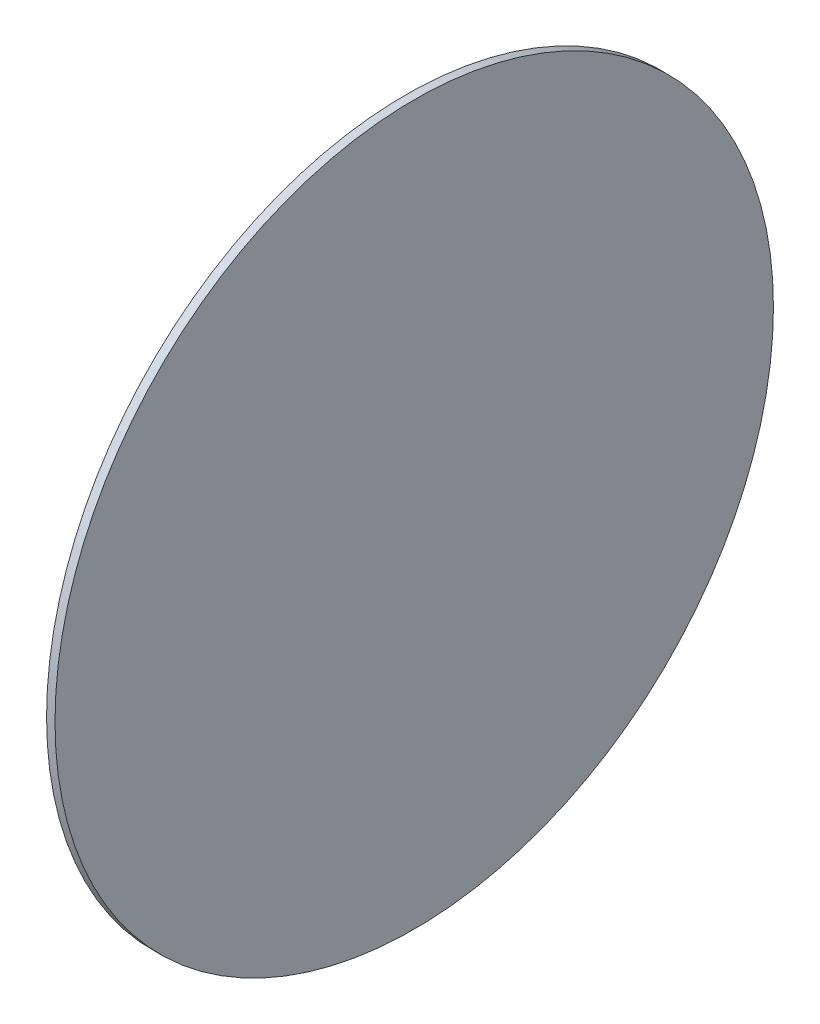
ISO-10303-21;
HEADER;
FILE_DESCRIPTION(('STEP AP214'),'2;1');
FILE_NAME('part.step','',(''),(''),'','','');
FILE_SCHEMA(('AUTOMOTIVE_DESIGN { 1 0 10303 214 1 1 1 1 }'));
ENDSEC;
DATA;
#1=APPLICATION_CONTEXT('core data for automotive mechanical design processes');
#2=APPLICATION_PROTOCOL_DEFINITION('international standard','automotive_design',2000,#1);
#3=PRODUCT_CONTEXT('',#1,'mechanical');
#4=PRODUCT('Part','Part','',(#3));
#5=PRODUCT_RELATED_PRODUCT_CATEGORY('part','',(#4));
#6=PRODUCT_DEFINITION_FORMATION('','',#4);
#7=PRODUCT_DEFINITION_CONTEXT('part definition',#1,'design');
#8=PRODUCT_DEFINITION('design','',#6,#7);
#9=PRODUCT_DEFINITION_SHAPE('','',#8);
#10=(LENGTH_UNIT() NAMED_UNIT(*) SI_UNIT(.MILLI.,.METRE.));
#11=(NAMED_UNIT(*) PLANE_ANGLE_UNIT() SI_UNIT($,.RADIAN.));
#12=(NAMED_UNIT(*) SI_UNIT($,.STERADIAN.) SOLID_ANGLE_UNIT());
#13=UNCERTAINTY_MEASURE_WITH_UNIT(LENGTH_MEASURE(1.E-05),#10,'distance_accuracy_value','');
#14=(GEOMETRIC_REPRESENTATION_CONTEXT(3) GLOBAL_UNCERTAINTY_ASSIGNED_CONTEXT((#13)) GLOBAL_UNIT_ASSIGNED_CONTEXT((#10,
#11,#12)) REPRESENTATION_CONTEXT('',''));
#15=CARTESIAN_POINT('',(0.,0.,0.));
#16=DIRECTION('',(0.,0.,1.));
#17=DIRECTION('',(1.,0.,0.));
#18=AXIS2_PLACEMENT_3D('',#15,#16,#17);
#19=CARTESIAN_POINT('',(2.0066,0.,0.));
#20=DIRECTION('',(-1.,0.,0.));
#21=DIRECTION('',(0.,0.,1.));
#22=AXIS2_PLACEMENT_3D('',#19,#20,#21);
#23=CYLINDRICAL_SURFACE('',#22,85.344);
#24=CARTESIAN_POINT('',(2.0066,0.,0.));
#25=DIRECTION('',(1.,0.,0.));
#26=DIRECTION('',(0.,0.,-1.));
#27=AXIS2_PLACEMENT_3D('',#24,#25,#26);
#28=CIRCLE('',#27,85.344);
#29=CARTESIAN_POINT('',(2.0066,0.,-85.344));
#30=VERTEX_POINT('',#29);
#31=EDGE_CURVE('E10',#30,#30,#28,.T.);
#32=ORIENTED_EDGE('',*,*,#31,.F.);
#33=EDGE_LOOP('',(#32));
#34=FACE_BOUND('',#33,.T.);
#35=CARTESIAN_POINT('',(0.,0.,0.));
#36=DIRECTION('',(1.,0.,0.));
#37=DIRECTION('',(0.,0.,-1.));
#38=AXIS2_PLACEMENT_3D('',#35,#36,#37);
#39=CIRCLE('',#38,85.344);
#40=CARTESIAN_POINT('',(0.,0.,-85.344));
#41=VERTEX_POINT('',#40);
#42=EDGE_CURVE('E46',#41,#41,#39,.T.);
#43=ORIENTED_EDGE('',*,*,#42,.T.);
#44=EDGE_LOOP('',(#43));
#45=FACE_BOUND('',#44,.T.);
#46=ADVANCED_FACE('F43',(#34,#45),#23,.T.);
#47=CARTESIAN_POINT('',(2.0066,0.,0.));
#48=DIRECTION('',(1.,0.,0.));
#49=DIRECTION('',(0.,0.,-1.));
#50=AXIS2_PLACEMENT_3D('',#47,#48,#49);
#51=PLANE('',#50);
#52=ORIENTED_EDGE('',*,*,#31,.T.);
#53=EDGE_LOOP('',(#52));
#54=FACE_BOUND('',#53,.T.);
#55=ADVANCED_FACE('F60',(#54),#51,.T.);
#56=CARTESIAN_POINT('',(0.,0.,0.));
#57=DIRECTION('',(1.,0.,0.));
#58=DIRECTION('',(0.,0.,-1.));
#59=AXIS2_PLACEMENT_3D('',#56,#57,#58);
#60=PLANE('',#59);
#61=ORIENTED_EDGE('',*,*,#42,.F.);
#62=EDGE_LOOP('',(#61));
#63=FACE_BOUND('',#62,.T.);
#64=ADVANCED_FACE('F58',(#63),#60,.F.);
#65=CLOSED_SHELL('',(#46,#55,#64));
#66=MANIFOLD_SOLID_BREP('B2',#65);
#67=ADVANCED_BREP_SHAPE_REPRESENTATION('',(#18,#66),#14);
#68=SHAPE_DEFINITION_REPRESENTATION(#9,#67);
ENDSEC;
END-ISO-10303-21;
